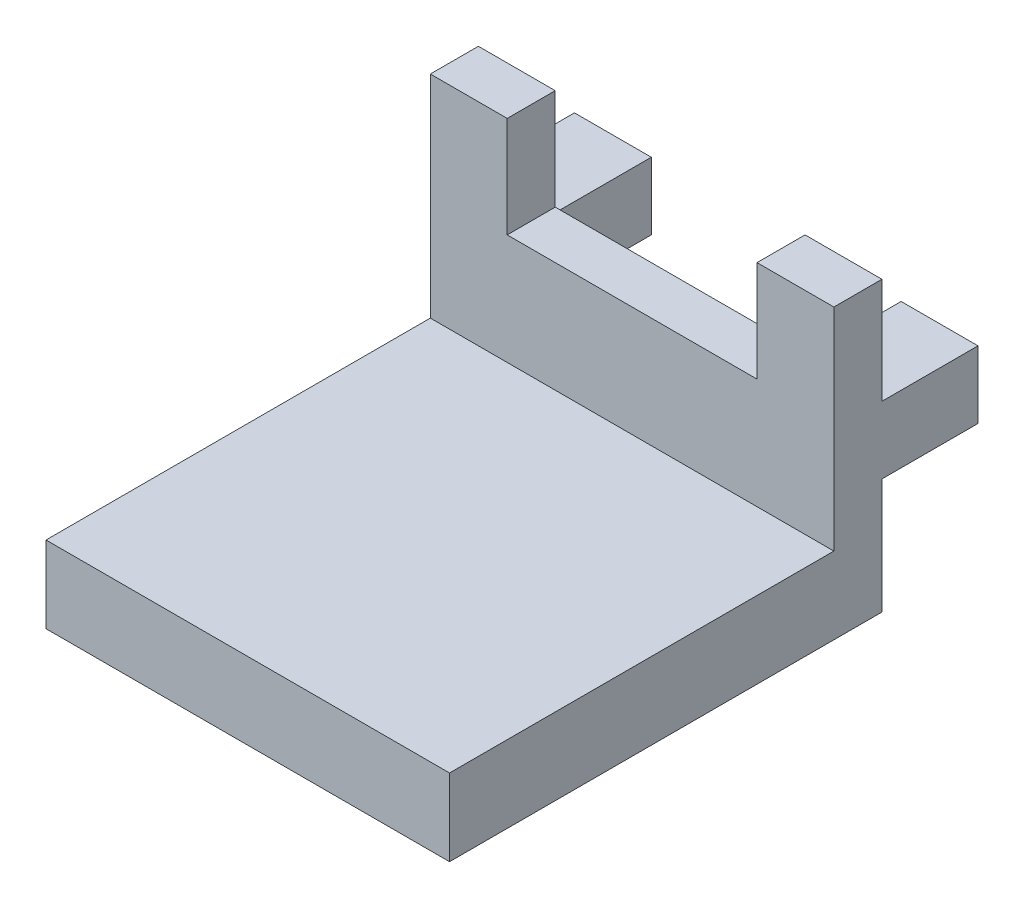
ISO-10303-21;
HEADER;
FILE_DESCRIPTION(('STEP AP214'),'2;1');
FILE_NAME('part.step','',(''),(''),'','','');
FILE_SCHEMA(('AUTOMOTIVE_DESIGN { 1 0 10303 214 1 1 1 1 }'));
ENDSEC;
DATA;
#1=APPLICATION_CONTEXT('core data for automotive mechanical design processes');
#2=APPLICATION_PROTOCOL_DEFINITION('international standard','automotive_design',2000,#1);
#3=PRODUCT_CONTEXT('',#1,'mechanical');
#4=PRODUCT('Part','Part','',(#3));
#5=PRODUCT_RELATED_PRODUCT_CATEGORY('part','',(#4));
#6=PRODUCT_DEFINITION_FORMATION('','',#4);
#7=PRODUCT_DEFINITION_CONTEXT('part definition',#1,'design');
#8=PRODUCT_DEFINITION('design','',#6,#7);
#9=PRODUCT_DEFINITION_SHAPE('','',#8);
#10=(LENGTH_UNIT() NAMED_UNIT(*) SI_UNIT(.MILLI.,.METRE.));
#11=(NAMED_UNIT(*) PLANE_ANGLE_UNIT() SI_UNIT($,.RADIAN.));
#12=(NAMED_UNIT(*) SI_UNIT($,.STERADIAN.) SOLID_ANGLE_UNIT());
#13=UNCERTAINTY_MEASURE_WITH_UNIT(LENGTH_MEASURE(1.E-05),#10,'distance_accuracy_value','');
#14=(GEOMETRIC_REPRESENTATION_CONTEXT(3) GLOBAL_UNCERTAINTY_ASSIGNED_CONTEXT((#13)) GLOBAL_UNIT_ASSIGNED_CONTEXT((#10,
#11,#12)) REPRESENTATION_CONTEXT('',''));
#15=CARTESIAN_POINT('',(0.,0.,0.));
#16=DIRECTION('',(0.,0.,1.));
#17=DIRECTION('',(1.,0.,0.));
#18=AXIS2_PLACEMENT_3D('',#15,#16,#17);
#19=CARTESIAN_POINT('',(0.,0.,5.));
#20=DIRECTION('',(0.,0.,-1.));
#21=DIRECTION('',(-1.,0.,0.));
#22=AXIS2_PLACEMENT_3D('',#19,#20,#21);
#23=PLANE('',#22);
#24=DIRECTION('',(-1.,0.,0.));
#25=VECTOR('',#24,1.);
#26=CARTESIAN_POINT('',(-17.5160225942722,-8.03953553605721,5.));
#27=LINE('',#26,#25);
#28=CARTESIAN_POINT('',(24.4839774057278,-8.03953553605721,5.));
#29=VERTEX_POINT('',#28);
#30=CARTESIAN_POINT('',(-17.5160225942722,-8.03953553605721,5.));
#31=VERTEX_POINT('',#30);
#32=EDGE_CURVE('E48',#29,#31,#27,.T.);
#33=ORIENTED_EDGE('',*,*,#32,.F.);
#34=DIRECTION('',(0.,1.,0.));
#35=VECTOR('',#34,1.);
#36=CARTESIAN_POINT('',(24.4839774057278,-16.0395355360572,5.));
#37=LINE('',#36,#35);
#38=CARTESIAN_POINT('',(24.4839774057278,13.9604644639428,5.));
#39=VERTEX_POINT('',#38);
#40=EDGE_CURVE('E254',#29,#39,#37,.T.);
#41=ORIENTED_EDGE('',*,*,#40,.T.);
#42=DIRECTION('',(-1.,0.,0.));
#43=VECTOR('',#42,1.);
#44=CARTESIAN_POINT('',(16.4839774057278,13.9604644639428,5.));
#45=LINE('',#44,#43);
#46=CARTESIAN_POINT('',(16.4839774057278,13.9604644639428,5.));
#47=VERTEX_POINT('',#46);
#48=EDGE_CURVE('E256',#39,#47,#45,.T.);
#49=ORIENTED_EDGE('',*,*,#48,.T.);
#50=DIRECTION('',(0.,-1.,0.));
#51=VECTOR('',#50,1.);
#52=CARTESIAN_POINT('',(16.4839774057278,3.46046446394278,5.));
#53=LINE('',#52,#51);
#54=CARTESIAN_POINT('',(16.4839774057278,3.46046446394278,5.));
#55=VERTEX_POINT('',#54);
#56=EDGE_CURVE('E258',#47,#55,#53,.T.);
#57=ORIENTED_EDGE('',*,*,#56,.T.);
#58=DIRECTION('',(-1.,0.,0.));
#59=VECTOR('',#58,1.);
#60=CARTESIAN_POINT('',(-9.51602259427217,3.46046446394278,5.));
#61=LINE('',#60,#59);
#62=CARTESIAN_POINT('',(-9.51602259427217,3.46046446394278,5.));
#63=VERTEX_POINT('',#62);
#64=EDGE_CURVE('E260',#55,#63,#61,.T.);
#65=ORIENTED_EDGE('',*,*,#64,.T.);
#66=DIRECTION('',(0.,1.,0.));
#67=VECTOR('',#66,1.);
#68=CARTESIAN_POINT('',(-9.51602259427217,13.9604644639428,5.));
#69=LINE('',#68,#67);
#70=CARTESIAN_POINT('',(-9.51602259427217,13.9604644639428,5.));
#71=VERTEX_POINT('',#70);
#72=EDGE_CURVE('E262',#63,#71,#69,.T.);
#73=ORIENTED_EDGE('',*,*,#72,.T.);
#74=DIRECTION('',(-1.,0.,0.));
#75=VECTOR('',#74,1.);
#76=CARTESIAN_POINT('',(-17.5160225942722,13.9604644639428,5.));
#77=LINE('',#76,#75);
#78=CARTESIAN_POINT('',(-17.5160225942722,13.9604644639428,5.));
#79=VERTEX_POINT('',#78);
#80=EDGE_CURVE('E248',#71,#79,#77,.T.);
#81=ORIENTED_EDGE('',*,*,#80,.T.);
#82=DIRECTION('',(0.,-1.,0.));
#83=VECTOR('',#82,1.);
#84=CARTESIAN_POINT('',(-17.5160225942722,13.9604644639428,5.));
#85=LINE('',#84,#83);
#86=EDGE_CURVE('E251',#79,#31,#85,.T.);
#87=ORIENTED_EDGE('',*,*,#86,.T.);
#88=EDGE_LOOP('',(#33,#41,#49,#57,#65,#73,#81,#87));
#89=FACE_BOUND('',#88,.T.);
#90=ADVANCED_FACE('F33',(#89),#23,.F.);
#91=CARTESIAN_POINT('',(0.,0.,0.));
#92=DIRECTION('',(0.,0.,-1.));
#93=DIRECTION('',(-1.,0.,0.));
#94=AXIS2_PLACEMENT_3D('',#91,#92,#93);
#95=PLANE('',#94);
#96=DIRECTION('',(0.,-1.,0.));
#97=VECTOR('',#96,1.);
#98=CARTESIAN_POINT('',(-17.5160225942722,13.9604644639428,0.));
#99=LINE('',#98,#97);
#100=CARTESIAN_POINT('',(-17.5160225942722,-4.03953553605722,0.));
#101=VERTEX_POINT('',#100);
#102=CARTESIAN_POINT('',(-17.5160225942722,-16.0395355360572,0.));
#103=VERTEX_POINT('',#102);
#104=EDGE_CURVE('E167',#101,#103,#99,.T.);
#105=ORIENTED_EDGE('',*,*,#104,.F.);
#106=DIRECTION('',(-1.,0.,0.));
#107=VECTOR('',#106,1.);
#108=CARTESIAN_POINT('',(-9.51602259427217,-4.03953553605722,0.));
#109=LINE('',#108,#107);
#110=CARTESIAN_POINT('',(-9.51602259427217,-4.03953553605722,0.));
#111=VERTEX_POINT('',#110);
#112=EDGE_CURVE('E207',#111,#101,#109,.T.);
#113=ORIENTED_EDGE('',*,*,#112,.F.);
#114=DIRECTION('',(0.,-1.,0.));
#115=VECTOR('',#114,1.);
#116=CARTESIAN_POINT('',(-9.51602259427217,2.96046446394278,0.));
#117=LINE('',#116,#115);
#118=CARTESIAN_POINT('',(-9.51602259427217,2.96046446394278,0.));
#119=VERTEX_POINT('',#118);
#120=EDGE_CURVE('E193',#119,#111,#117,.T.);
#121=ORIENTED_EDGE('',*,*,#120,.F.);
#122=DIRECTION('',(1.,0.,0.));
#123=VECTOR('',#122,1.);
#124=CARTESIAN_POINT('',(-9.51602259427217,2.96046446394278,0.));
#125=LINE('',#124,#123);
#126=CARTESIAN_POINT('',(-17.5160225942722,2.96046446394278,0.));
#127=VERTEX_POINT('',#126);
#128=EDGE_CURVE('E198',#127,#119,#125,.T.);
#129=ORIENTED_EDGE('',*,*,#128,.F.);
#130=CARTESIAN_POINT('',(-17.5160225942722,13.9604644639428,0.));
#131=VERTEX_POINT('',#130);
#132=EDGE_CURVE('E267',#131,#127,#99,.T.);
#133=ORIENTED_EDGE('',*,*,#132,.F.);
#134=DIRECTION('',(-1.,0.,0.));
#135=VECTOR('',#134,1.);
#136=CARTESIAN_POINT('',(-17.5160225942722,13.9604644639428,0.));
#137=LINE('',#136,#135);
#138=CARTESIAN_POINT('',(-9.51602259427217,13.9604644639428,0.));
#139=VERTEX_POINT('',#138);
#140=EDGE_CURVE('E247',#139,#131,#137,.T.);
#141=ORIENTED_EDGE('',*,*,#140,.F.);
#142=DIRECTION('',(0.,1.,0.));
#143=VECTOR('',#142,1.);
#144=CARTESIAN_POINT('',(-9.51602259427217,13.9604644639428,0.));
#145=LINE('',#144,#143);
#146=CARTESIAN_POINT('',(-9.51602259427217,3.46046446394278,0.));
#147=VERTEX_POINT('',#146);
#148=EDGE_CURVE('E252',#147,#139,#145,.T.);
#149=ORIENTED_EDGE('',*,*,#148,.F.);
#150=DIRECTION('',(-1.,0.,0.));
#151=VECTOR('',#150,1.);
#152=CARTESIAN_POINT('',(-9.51602259427217,3.46046446394278,0.));
#153=LINE('',#152,#151);
#154=CARTESIAN_POINT('',(16.4839774057278,3.46046446394278,0.));
#155=VERTEX_POINT('',#154);
#156=EDGE_CURVE('E279',#155,#147,#153,.T.);
#157=ORIENTED_EDGE('',*,*,#156,.F.);
#158=DIRECTION('',(0.,-1.,0.));
#159=VECTOR('',#158,1.);
#160=CARTESIAN_POINT('',(16.4839774057278,3.46046446394278,0.));
#161=LINE('',#160,#159);
#162=CARTESIAN_POINT('',(16.4839774057278,13.9604644639428,0.));
#163=VERTEX_POINT('',#162);
#164=EDGE_CURVE('E277',#163,#155,#161,.T.);
#165=ORIENTED_EDGE('',*,*,#164,.F.);
#166=DIRECTION('',(-1.,0.,0.));
#167=VECTOR('',#166,1.);
#168=CARTESIAN_POINT('',(16.4839774057278,13.9604644639428,0.));
#169=LINE('',#168,#167);
#170=CARTESIAN_POINT('',(24.4839774057278,13.9604644639428,0.));
#171=VERTEX_POINT('',#170);
#172=EDGE_CURVE('E275',#171,#163,#169,.T.);
#173=ORIENTED_EDGE('',*,*,#172,.F.);
#174=DIRECTION('',(0.,1.,0.));
#175=VECTOR('',#174,1.);
#176=CARTESIAN_POINT('',(24.4839774057278,-16.0395355360572,0.));
#177=LINE('',#176,#175);
#178=CARTESIAN_POINT('',(24.4839774057278,2.96046446394278,0.));
#179=VERTEX_POINT('',#178);
#180=EDGE_CURVE('E271',#179,#171,#177,.T.);
#181=ORIENTED_EDGE('',*,*,#180,.F.);
#182=DIRECTION('',(1.,0.,0.));
#183=VECTOR('',#182,1.);
#184=CARTESIAN_POINT('',(24.4839774057278,2.96046446394278,0.));
#185=LINE('',#184,#183);
#186=CARTESIAN_POINT('',(16.4839774057278,2.96046446394278,0.));
#187=VERTEX_POINT('',#186);
#188=EDGE_CURVE('E222',#187,#179,#185,.T.);
#189=ORIENTED_EDGE('',*,*,#188,.F.);
#190=DIRECTION('',(0.,1.,0.));
#191=VECTOR('',#190,1.);
#192=CARTESIAN_POINT('',(16.4839774057278,2.96046446394278,0.));
#193=LINE('',#192,#191);
#194=CARTESIAN_POINT('',(16.4839774057278,-4.03953553605722,0.));
#195=VERTEX_POINT('',#194);
#196=EDGE_CURVE('E231',#195,#187,#193,.T.);
#197=ORIENTED_EDGE('',*,*,#196,.F.);
#198=DIRECTION('',(-1.,0.,0.));
#199=VECTOR('',#198,1.);
#200=CARTESIAN_POINT('',(24.4839774057278,-4.03953553605722,0.));
#201=LINE('',#200,#199);
#202=CARTESIAN_POINT('',(24.4839774057278,-4.03953553605722,0.));
#203=VERTEX_POINT('',#202);
#204=EDGE_CURVE('E217',#203,#195,#201,.T.);
#205=ORIENTED_EDGE('',*,*,#204,.F.);
#206=CARTESIAN_POINT('',(24.4839774057278,-16.0395355360572,0.));
#207=VERTEX_POINT('',#206);
#208=EDGE_CURVE('E272',#207,#203,#177,.T.);
#209=ORIENTED_EDGE('',*,*,#208,.F.);
#210=DIRECTION('',(1.,0.,0.));
#211=VECTOR('',#210,1.);
#212=CARTESIAN_POINT('',(-17.5160225942722,-16.0395355360572,0.));
#213=LINE('',#212,#211);
#214=EDGE_CURVE('E269',#103,#207,#213,.T.);
#215=ORIENTED_EDGE('',*,*,#214,.F.);
#216=EDGE_LOOP('',(#105,#113,#121,#129,#133,#141,#149,#157,#165,#173,#181,#189,#197,#205,#209,#215));
#217=FACE_BOUND('',#216,.T.);
#218=ADVANCED_FACE('F302',(#217),#95,.T.);
#219=CARTESIAN_POINT('',(-17.5160225942722,13.9604644639428,5.));
#220=DIRECTION('',(0.,-1.,0.));
#221=DIRECTION('',(0.,0.,-1.));
#222=AXIS2_PLACEMENT_3D('',#219,#220,#221);
#223=PLANE('',#222);
#224=ORIENTED_EDGE('',*,*,#140,.T.);
#225=DIRECTION('',(0.,0.,-1.));
#226=VECTOR('',#225,1.);
#227=CARTESIAN_POINT('',(-17.5160225942722,13.9604644639428,5.));
#228=LINE('',#227,#226);
#229=EDGE_CURVE('E11',#79,#131,#228,.T.);
#230=ORIENTED_EDGE('',*,*,#229,.F.);
#231=ORIENTED_EDGE('',*,*,#80,.F.);
#232=DIRECTION('',(0.,0.,-1.));
#233=VECTOR('',#232,1.);
#234=CARTESIAN_POINT('',(-9.51602259427217,13.9604644639428,5.));
#235=LINE('',#234,#233);
#236=EDGE_CURVE('E264',#71,#139,#235,.T.);
#237=ORIENTED_EDGE('',*,*,#236,.T.);
#238=EDGE_LOOP('',(#224,#230,#231,#237));
#239=FACE_BOUND('',#238,.T.);
#240=ADVANCED_FACE('F35',(#239),#223,.F.);
#241=CARTESIAN_POINT('',(-17.5160225942722,13.9604644639428,5.));
#242=DIRECTION('',(1.,0.,0.));
#243=DIRECTION('',(0.,1.,0.));
#244=AXIS2_PLACEMENT_3D('',#241,#242,#243);
#245=PLANE('',#244);
#246=ORIENTED_EDGE('',*,*,#132,.T.);
#247=DIRECTION('',(0.,0.,1.));
#248=VECTOR('',#247,1.);
#249=CARTESIAN_POINT('',(-17.5160225942722,2.96046446394278,-10.));
#250=LINE('',#249,#248);
#251=CARTESIAN_POINT('',(-17.5160225942722,2.96046446394278,-10.));
#252=VERTEX_POINT('',#251);
#253=EDGE_CURVE('E56',#252,#127,#250,.T.);
#254=ORIENTED_EDGE('',*,*,#253,.F.);
#255=DIRECTION('',(0.,1.,0.));
#256=VECTOR('',#255,1.);
#257=CARTESIAN_POINT('',(-17.5160225942722,2.96046446394278,-10.));
#258=LINE('',#257,#256);
#259=CARTESIAN_POINT('',(-17.5160225942722,-4.03953553605722,-10.));
#260=VERTEX_POINT('',#259);
#261=EDGE_CURVE('E200',#260,#252,#258,.T.);
#262=ORIENTED_EDGE('',*,*,#261,.F.);
#263=DIRECTION('',(0.,0.,1.));
#264=VECTOR('',#263,1.);
#265=CARTESIAN_POINT('',(-17.5160225942722,-4.03953553605722,-10.));
#266=LINE('',#265,#264);
#267=EDGE_CURVE('E213',#260,#101,#266,.T.);
#268=ORIENTED_EDGE('',*,*,#267,.T.);
#269=ORIENTED_EDGE('',*,*,#104,.T.);
#270=DIRECTION('',(0.,0.,-1.));
#271=VECTOR('',#270,1.);
#272=CARTESIAN_POINT('',(-17.5160225942722,-16.0395355360572,5.));
#273=LINE('',#272,#271);
#274=CARTESIAN_POINT('',(-17.5160225942722,-16.0395355360572,45.));
#275=VERTEX_POINT('',#274);
#276=EDGE_CURVE('E41',#275,#103,#273,.T.);
#277=ORIENTED_EDGE('',*,*,#276,.F.);
#278=DIRECTION('',(0.,-1.,0.));
#279=VECTOR('',#278,1.);
#280=CARTESIAN_POINT('',(-17.5160225942722,-16.0395355360572,45.));
#281=LINE('',#280,#279);
#282=CARTESIAN_POINT('',(-17.5160225942722,-8.03953553605721,45.));
#283=VERTEX_POINT('',#282);
#284=EDGE_CURVE('E164',#283,#275,#281,.T.);
#285=ORIENTED_EDGE('',*,*,#284,.F.);
#286=DIRECTION('',(0.,0.,-1.));
#287=VECTOR('',#286,1.);
#288=CARTESIAN_POINT('',(-17.5160225942722,-8.03953553605721,45.));
#289=LINE('',#288,#287);
#290=EDGE_CURVE('E187',#283,#31,#289,.T.);
#291=ORIENTED_EDGE('',*,*,#290,.T.);
#292=ORIENTED_EDGE('',*,*,#86,.F.);
#293=ORIENTED_EDGE('',*,*,#229,.T.);
#294=EDGE_LOOP('',(#246,#254,#262,#268,#269,#277,#285,#291,#292,#293));
#295=FACE_BOUND('',#294,.T.);
#296=ADVANCED_FACE('F161',(#295),#245,.F.);
#297=CARTESIAN_POINT('',(-17.5160225942722,-16.0395355360572,5.));
#298=DIRECTION('',(0.,1.,0.));
#299=DIRECTION('',(-1.,0.,0.));
#300=AXIS2_PLACEMENT_3D('',#297,#298,#299);
#301=PLANE('',#300);
#302=ORIENTED_EDGE('',*,*,#214,.T.);
#303=DIRECTION('',(0.,0.,-1.));
#304=VECTOR('',#303,1.);
#305=CARTESIAN_POINT('',(24.4839774057278,-16.0395355360572,5.));
#306=LINE('',#305,#304);
#307=CARTESIAN_POINT('',(24.4839774057278,-16.0395355360572,45.));
#308=VERTEX_POINT('',#307);
#309=EDGE_CURVE('E170',#308,#207,#306,.T.);
#310=ORIENTED_EDGE('',*,*,#309,.F.);
#311=DIRECTION('',(1.,0.,0.));
#312=VECTOR('',#311,1.);
#313=CARTESIAN_POINT('',(-17.5160225942722,-16.0395355360572,45.));
#314=LINE('',#313,#312);
#315=EDGE_CURVE('E172',#275,#308,#314,.T.);
#316=ORIENTED_EDGE('',*,*,#315,.F.);
#317=ORIENTED_EDGE('',*,*,#276,.T.);
#318=EDGE_LOOP('',(#302,#310,#316,#317));
#319=FACE_BOUND('',#318,.T.);
#320=ADVANCED_FACE('F173',(#319),#301,.F.);
#321=CARTESIAN_POINT('',(24.4839774057278,-16.0395355360572,5.));
#322=DIRECTION('',(-1.,0.,0.));
#323=DIRECTION('',(0.,-1.,0.));
#324=AXIS2_PLACEMENT_3D('',#321,#322,#323);
#325=PLANE('',#324);
#326=ORIENTED_EDGE('',*,*,#208,.T.);
#327=DIRECTION('',(0.,0.,1.));
#328=VECTOR('',#327,1.);
#329=CARTESIAN_POINT('',(24.4839774057278,-4.03953553605722,-10.));
#330=LINE('',#329,#328);
#331=CARTESIAN_POINT('',(24.4839774057278,-4.03953553605722,-10.));
#332=VERTEX_POINT('',#331);
#333=EDGE_CURVE('E244',#332,#203,#330,.T.);
#334=ORIENTED_EDGE('',*,*,#333,.F.);
#335=DIRECTION('',(0.,-1.,0.));
#336=VECTOR('',#335,1.);
#337=CARTESIAN_POINT('',(24.4839774057278,2.96046446394278,-10.));
#338=LINE('',#337,#336);
#339=CARTESIAN_POINT('',(24.4839774057278,2.96046446394278,-10.));
#340=VERTEX_POINT('',#339);
#341=EDGE_CURVE('E218',#340,#332,#338,.T.);
#342=ORIENTED_EDGE('',*,*,#341,.F.);
#343=DIRECTION('',(0.,0.,1.));
#344=VECTOR('',#343,1.);
#345=CARTESIAN_POINT('',(24.4839774057278,2.96046446394278,-10.));
#346=LINE('',#345,#344);
#347=EDGE_CURVE('E228',#340,#179,#346,.T.);
#348=ORIENTED_EDGE('',*,*,#347,.T.);
#349=ORIENTED_EDGE('',*,*,#180,.T.);
#350=DIRECTION('',(0.,0.,-1.));
#351=VECTOR('',#350,1.);
#352=CARTESIAN_POINT('',(24.4839774057278,13.9604644639428,5.));
#353=LINE('',#352,#351);
#354=EDGE_CURVE('E293',#39,#171,#353,.T.);
#355=ORIENTED_EDGE('',*,*,#354,.F.);
#356=ORIENTED_EDGE('',*,*,#40,.F.);
#357=DIRECTION('',(0.,0.,-1.));
#358=VECTOR('',#357,1.);
#359=CARTESIAN_POINT('',(24.4839774057278,-8.03953553605721,45.));
#360=LINE('',#359,#358);
#361=CARTESIAN_POINT('',(24.4839774057278,-8.03953553605721,45.));
#362=VERTEX_POINT('',#361);
#363=EDGE_CURVE('E190',#362,#29,#360,.T.);
#364=ORIENTED_EDGE('',*,*,#363,.F.);
#365=DIRECTION('',(0.,1.,0.));
#366=VECTOR('',#365,1.);
#367=CARTESIAN_POINT('',(24.4839774057278,-16.0395355360572,45.));
#368=LINE('',#367,#366);
#369=EDGE_CURVE('E177',#308,#362,#368,.T.);
#370=ORIENTED_EDGE('',*,*,#369,.F.);
#371=ORIENTED_EDGE('',*,*,#309,.T.);
#372=EDGE_LOOP('',(#326,#334,#342,#348,#349,#355,#356,#364,#370,#371));
#373=FACE_BOUND('',#372,.T.);
#374=ADVANCED_FACE('F298',(#373),#325,.F.);
#375=CARTESIAN_POINT('',(16.4839774057278,13.9604644639428,5.));
#376=DIRECTION('',(0.,-1.,0.));
#377=DIRECTION('',(1.,0.,0.));
#378=AXIS2_PLACEMENT_3D('',#375,#376,#377);
#379=PLANE('',#378);
#380=ORIENTED_EDGE('',*,*,#172,.T.);
#381=DIRECTION('',(0.,0.,-1.));
#382=VECTOR('',#381,1.);
#383=CARTESIAN_POINT('',(16.4839774057278,13.9604644639428,5.));
#384=LINE('',#383,#382);
#385=EDGE_CURVE('E290',#47,#163,#384,.T.);
#386=ORIENTED_EDGE('',*,*,#385,.F.);
#387=ORIENTED_EDGE('',*,*,#48,.F.);
#388=ORIENTED_EDGE('',*,*,#354,.T.);
#389=EDGE_LOOP('',(#380,#386,#387,#388));
#390=FACE_BOUND('',#389,.T.);
#391=ADVANCED_FACE('F323',(#390),#379,.F.);
#392=CARTESIAN_POINT('',(16.4839774057278,3.46046446394278,5.));
#393=DIRECTION('',(1.,0.,0.));
#394=DIRECTION('',(0.,1.,0.));
#395=AXIS2_PLACEMENT_3D('',#392,#393,#394);
#396=PLANE('',#395);
#397=ORIENTED_EDGE('',*,*,#164,.T.);
#398=DIRECTION('',(0.,0.,-1.));
#399=VECTOR('',#398,1.);
#400=CARTESIAN_POINT('',(16.4839774057278,3.46046446394278,5.));
#401=LINE('',#400,#399);
#402=EDGE_CURVE('E287',#55,#155,#401,.T.);
#403=ORIENTED_EDGE('',*,*,#402,.F.);
#404=ORIENTED_EDGE('',*,*,#56,.F.);
#405=ORIENTED_EDGE('',*,*,#385,.T.);
#406=EDGE_LOOP('',(#397,#403,#404,#405));
#407=FACE_BOUND('',#406,.T.);
#408=ADVANCED_FACE('F327',(#407),#396,.F.);
#409=CARTESIAN_POINT('',(-9.51602259427217,3.46046446394278,5.));
#410=DIRECTION('',(0.,-1.,0.));
#411=DIRECTION('',(0.,0.,-1.));
#412=AXIS2_PLACEMENT_3D('',#409,#410,#411);
#413=PLANE('',#412);
#414=ORIENTED_EDGE('',*,*,#156,.T.);
#415=DIRECTION('',(0.,0.,-1.));
#416=VECTOR('',#415,1.);
#417=CARTESIAN_POINT('',(-9.51602259427217,3.46046446394278,5.));
#418=LINE('',#417,#416);
#419=EDGE_CURVE('E284',#63,#147,#418,.T.);
#420=ORIENTED_EDGE('',*,*,#419,.F.);
#421=ORIENTED_EDGE('',*,*,#64,.F.);
#422=ORIENTED_EDGE('',*,*,#402,.T.);
#423=EDGE_LOOP('',(#414,#420,#421,#422));
#424=FACE_BOUND('',#423,.T.);
#425=ADVANCED_FACE('F374',(#424),#413,.F.);
#426=CARTESIAN_POINT('',(-9.51602259427217,13.9604644639428,5.));
#427=DIRECTION('',(-1.,0.,0.));
#428=DIRECTION('',(0.,0.,1.));
#429=AXIS2_PLACEMENT_3D('',#426,#427,#428);
#430=PLANE('',#429);
#431=ORIENTED_EDGE('',*,*,#148,.T.);
#432=ORIENTED_EDGE('',*,*,#236,.F.);
#433=ORIENTED_EDGE('',*,*,#72,.F.);
#434=ORIENTED_EDGE('',*,*,#419,.T.);
#435=EDGE_LOOP('',(#431,#432,#433,#434));
#436=FACE_BOUND('',#435,.T.);
#437=ADVANCED_FACE('F371',(#436),#430,.F.);
#438=CARTESIAN_POINT('',(24.4839774057278,-4.03953553605722,-10.));
#439=DIRECTION('',(0.,1.,0.));
#440=DIRECTION('',(0.,0.,1.));
#441=AXIS2_PLACEMENT_3D('',#438,#439,#440);
#442=PLANE('',#441);
#443=ORIENTED_EDGE('',*,*,#204,.T.);
#444=DIRECTION('',(0.,0.,1.));
#445=VECTOR('',#444,1.);
#446=CARTESIAN_POINT('',(16.4839774057278,-4.03953553605722,-10.));
#447=LINE('',#446,#445);
#448=CARTESIAN_POINT('',(16.4839774057278,-4.03953553605722,-10.));
#449=VERTEX_POINT('',#448);
#450=EDGE_CURVE('E241',#449,#195,#447,.T.);
#451=ORIENTED_EDGE('',*,*,#450,.F.);
#452=DIRECTION('',(-1.,0.,0.));
#453=VECTOR('',#452,1.);
#454=CARTESIAN_POINT('',(24.4839774057278,-4.03953553605722,-10.));
#455=LINE('',#454,#453);
#456=EDGE_CURVE('E221',#332,#449,#455,.T.);
#457=ORIENTED_EDGE('',*,*,#456,.F.);
#458=ORIENTED_EDGE('',*,*,#333,.T.);
#459=EDGE_LOOP('',(#443,#451,#457,#458));
#460=FACE_BOUND('',#459,.T.);
#461=ADVANCED_FACE('F305',(#460),#442,.F.);
#462=CARTESIAN_POINT('',(16.4839774057278,2.96046446394278,-10.));
#463=DIRECTION('',(1.,0.,0.));
#464=DIRECTION('',(0.,0.,-1.));
#465=AXIS2_PLACEMENT_3D('',#462,#463,#464);
#466=PLANE('',#465);
#467=ORIENTED_EDGE('',*,*,#196,.T.);
#468=DIRECTION('',(0.,0.,1.));
#469=VECTOR('',#468,1.);
#470=CARTESIAN_POINT('',(16.4839774057278,2.96046446394278,-10.));
#471=LINE('',#470,#469);
#472=CARTESIAN_POINT('',(16.4839774057278,2.96046446394278,-10.));
#473=VERTEX_POINT('',#472);
#474=EDGE_CURVE('E238',#473,#187,#471,.T.);
#475=ORIENTED_EDGE('',*,*,#474,.F.);
#476=DIRECTION('',(0.,1.,0.));
#477=VECTOR('',#476,1.);
#478=CARTESIAN_POINT('',(16.4839774057278,2.96046446394278,-10.));
#479=LINE('',#478,#477);
#480=EDGE_CURVE('E224',#449,#473,#479,.T.);
#481=ORIENTED_EDGE('',*,*,#480,.F.);
#482=ORIENTED_EDGE('',*,*,#450,.T.);
#483=EDGE_LOOP('',(#467,#475,#481,#482));
#484=FACE_BOUND('',#483,.T.);
#485=ADVANCED_FACE('F308',(#484),#466,.F.);
#486=CARTESIAN_POINT('',(24.4839774057278,2.96046446394278,-10.));
#487=DIRECTION('',(0.,-1.,0.));
#488=DIRECTION('',(0.,0.,-1.));
#489=AXIS2_PLACEMENT_3D('',#486,#487,#488);
#490=PLANE('',#489);
#491=ORIENTED_EDGE('',*,*,#188,.T.);
#492=ORIENTED_EDGE('',*,*,#347,.F.);
#493=DIRECTION('',(1.,0.,0.));
#494=VECTOR('',#493,1.);
#495=CARTESIAN_POINT('',(24.4839774057278,2.96046446394278,-10.));
#496=LINE('',#495,#494);
#497=EDGE_CURVE('E226',#473,#340,#496,.T.);
#498=ORIENTED_EDGE('',*,*,#497,.F.);
#499=ORIENTED_EDGE('',*,*,#474,.T.);
#500=EDGE_LOOP('',(#491,#492,#498,#499));
#501=FACE_BOUND('',#500,.T.);
#502=ADVANCED_FACE('F317',(#501),#490,.F.);
#503=CARTESIAN_POINT('',(0.,0.,-10.));
#504=DIRECTION('',(0.,0.,-1.));
#505=DIRECTION('',(-1.,0.,0.));
#506=AXIS2_PLACEMENT_3D('',#503,#504,#505);
#507=PLANE('',#506);
#508=ORIENTED_EDGE('',*,*,#341,.T.);
#509=ORIENTED_EDGE('',*,*,#456,.T.);
#510=ORIENTED_EDGE('',*,*,#480,.T.);
#511=ORIENTED_EDGE('',*,*,#497,.T.);
#512=EDGE_LOOP('',(#508,#509,#510,#511));
#513=FACE_BOUND('',#512,.T.);
#514=ADVANCED_FACE('F312',(#513),#507,.T.);
#515=CARTESIAN_POINT('',(-9.51602259427217,2.96046446394278,-10.));
#516=DIRECTION('',(-1.,0.,0.));
#517=DIRECTION('',(0.,0.,1.));
#518=AXIS2_PLACEMENT_3D('',#515,#516,#517);
#519=PLANE('',#518);
#520=ORIENTED_EDGE('',*,*,#120,.T.);
#521=DIRECTION('',(0.,0.,1.));
#522=VECTOR('',#521,1.);
#523=CARTESIAN_POINT('',(-9.51602259427217,-4.03953553605722,-10.));
#524=LINE('',#523,#522);
#525=CARTESIAN_POINT('',(-9.51602259427217,-4.03953553605722,-10.));
#526=VERTEX_POINT('',#525);
#527=EDGE_CURVE('E215',#526,#111,#524,.T.);
#528=ORIENTED_EDGE('',*,*,#527,.F.);
#529=DIRECTION('',(0.,-1.,0.));
#530=VECTOR('',#529,1.);
#531=CARTESIAN_POINT('',(-9.51602259427217,2.96046446394278,-10.));
#532=LINE('',#531,#530);
#533=CARTESIAN_POINT('',(-9.51602259427217,2.96046446394278,-10.));
#534=VERTEX_POINT('',#533);
#535=EDGE_CURVE('E194',#534,#526,#532,.T.);
#536=ORIENTED_EDGE('',*,*,#535,.F.);
#537=DIRECTION('',(0.,0.,1.));
#538=VECTOR('',#537,1.);
#539=CARTESIAN_POINT('',(-9.51602259427217,2.96046446394278,-10.));
#540=LINE('',#539,#538);
#541=EDGE_CURVE('E204',#534,#119,#540,.T.);
#542=ORIENTED_EDGE('',*,*,#541,.T.);
#543=EDGE_LOOP('',(#520,#528,#536,#542));
#544=FACE_BOUND('',#543,.T.);
#545=ADVANCED_FACE('F353',(#544),#519,.F.);
#546=CARTESIAN_POINT('',(-9.51602259427217,-4.03953553605722,-10.));
#547=DIRECTION('',(0.,1.,0.));
#548=DIRECTION('',(0.,0.,1.));
#549=AXIS2_PLACEMENT_3D('',#546,#547,#548);
#550=PLANE('',#549);
#551=ORIENTED_EDGE('',*,*,#112,.T.);
#552=ORIENTED_EDGE('',*,*,#267,.F.);
#553=DIRECTION('',(-1.,0.,0.));
#554=VECTOR('',#553,1.);
#555=CARTESIAN_POINT('',(-9.51602259427217,-4.03953553605722,-10.));
#556=LINE('',#555,#554);
#557=EDGE_CURVE('E197',#526,#260,#556,.T.);
#558=ORIENTED_EDGE('',*,*,#557,.F.);
#559=ORIENTED_EDGE('',*,*,#527,.T.);
#560=EDGE_LOOP('',(#551,#552,#558,#559));
#561=FACE_BOUND('',#560,.T.);
#562=ADVANCED_FACE('F350',(#561),#550,.F.);
#563=CARTESIAN_POINT('',(-9.51602259427217,2.96046446394278,-10.));
#564=DIRECTION('',(0.,-1.,0.));
#565=DIRECTION('',(1.,0.,0.));
#566=AXIS2_PLACEMENT_3D('',#563,#564,#565);
#567=PLANE('',#566);
#568=ORIENTED_EDGE('',*,*,#128,.T.);
#569=ORIENTED_EDGE('',*,*,#541,.F.);
#570=DIRECTION('',(1.,0.,0.));
#571=VECTOR('',#570,1.);
#572=CARTESIAN_POINT('',(-9.51602259427217,2.96046446394278,-10.));
#573=LINE('',#572,#571);
#574=EDGE_CURVE('E202',#252,#534,#573,.T.);
#575=ORIENTED_EDGE('',*,*,#574,.F.);
#576=ORIENTED_EDGE('',*,*,#253,.T.);
#577=EDGE_LOOP('',(#568,#569,#575,#576));
#578=FACE_BOUND('',#577,.T.);
#579=ADVANCED_FACE('F343',(#578),#567,.F.);
#580=CARTESIAN_POINT('',(0.,0.,-10.));
#581=DIRECTION('',(0.,0.,-1.));
#582=DIRECTION('',(-1.,0.,0.));
#583=AXIS2_PLACEMENT_3D('',#580,#581,#582);
#584=PLANE('',#583);
#585=ORIENTED_EDGE('',*,*,#535,.T.);
#586=ORIENTED_EDGE('',*,*,#557,.T.);
#587=ORIENTED_EDGE('',*,*,#261,.T.);
#588=ORIENTED_EDGE('',*,*,#574,.T.);
#589=EDGE_LOOP('',(#585,#586,#587,#588));
#590=FACE_BOUND('',#589,.T.);
#591=ADVANCED_FACE('F346',(#590),#584,.T.);
#592=CARTESIAN_POINT('',(-17.5160225942722,-8.03953553605721,45.));
#593=DIRECTION('',(0.,-1.,0.));
#594=DIRECTION('',(0.,0.,-1.));
#595=AXIS2_PLACEMENT_3D('',#592,#593,#594);
#596=PLANE('',#595);
#597=ORIENTED_EDGE('',*,*,#32,.T.);
#598=ORIENTED_EDGE('',*,*,#290,.F.);
#599=DIRECTION('',(-1.,0.,0.));
#600=VECTOR('',#599,1.);
#601=CARTESIAN_POINT('',(-17.5160225942722,-8.03953553605721,45.));
#602=LINE('',#601,#600);
#603=EDGE_CURVE('E181',#362,#283,#602,.T.);
#604=ORIENTED_EDGE('',*,*,#603,.F.);
#605=ORIENTED_EDGE('',*,*,#363,.T.);
#606=EDGE_LOOP('',(#597,#598,#604,#605));
#607=FACE_BOUND('',#606,.T.);
#608=ADVANCED_FACE('F332',(#607),#596,.F.);
#609=CARTESIAN_POINT('',(0.,0.,45.));
#610=DIRECTION('',(0.,0.,-1.));
#611=DIRECTION('',(-1.,0.,0.));
#612=AXIS2_PLACEMENT_3D('',#609,#610,#611);
#613=PLANE('',#612);
#614=ORIENTED_EDGE('',*,*,#284,.T.);
#615=ORIENTED_EDGE('',*,*,#315,.T.);
#616=ORIENTED_EDGE('',*,*,#369,.T.);
#617=ORIENTED_EDGE('',*,*,#603,.T.);
#618=EDGE_LOOP('',(#614,#615,#616,#617));
#619=FACE_BOUND('',#618,.T.);
#620=ADVANCED_FACE('F179',(#619),#613,.F.);
#621=CLOSED_SHELL('',(#90,#218,#240,#296,#320,#374,#391,#408,#425,#437,#461,#485,#502,#514,#545,
#562,#579,#591,#608,#620));
#622=MANIFOLD_SOLID_BREP('B2',#621);
#623=ADVANCED_BREP_SHAPE_REPRESENTATION('',(#18,#622),#14);
#624=SHAPE_DEFINITION_REPRESENTATION(#9,#623);
ENDSEC;
END-ISO-10303-21;
